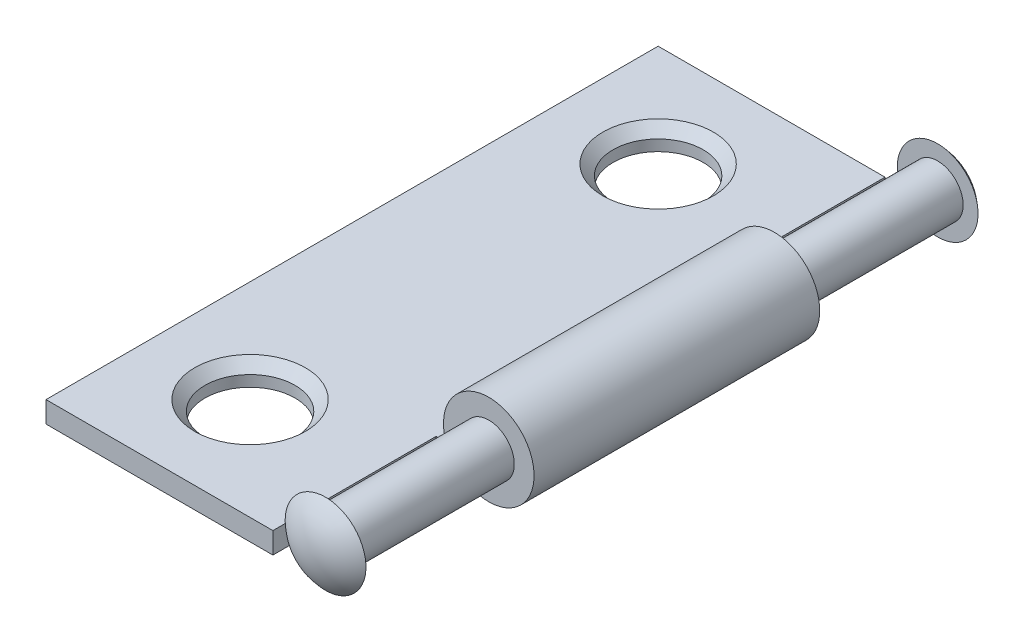
ISO-10303-21;
HEADER;
FILE_DESCRIPTION(('STEP AP214'),'2;1');
FILE_NAME('part.step','',(''),(''),'','','');
FILE_SCHEMA(('AUTOMOTIVE_DESIGN { 1 0 10303 214 1 1 1 1 }'));
ENDSEC;
DATA;
#1=APPLICATION_CONTEXT('core data for automotive mechanical design processes');
#2=APPLICATION_PROTOCOL_DEFINITION('international standard','automotive_design',2000,#1);
#3=PRODUCT_CONTEXT('',#1,'mechanical');
#4=PRODUCT('Part','Part','',(#3));
#5=PRODUCT_RELATED_PRODUCT_CATEGORY('part','',(#4));
#6=PRODUCT_DEFINITION_FORMATION('','',#4);
#7=PRODUCT_DEFINITION_CONTEXT('part definition',#1,'design');
#8=PRODUCT_DEFINITION('design','',#6,#7);
#9=PRODUCT_DEFINITION_SHAPE('','',#8);
#10=(LENGTH_UNIT() NAMED_UNIT(*) SI_UNIT(.MILLI.,.METRE.));
#11=(NAMED_UNIT(*) PLANE_ANGLE_UNIT() SI_UNIT($,.RADIAN.));
#12=(NAMED_UNIT(*) SI_UNIT($,.STERADIAN.) SOLID_ANGLE_UNIT());
#13=UNCERTAINTY_MEASURE_WITH_UNIT(LENGTH_MEASURE(1.E-05),#10,'distance_accuracy_value','');
#14=(GEOMETRIC_REPRESENTATION_CONTEXT(3) GLOBAL_UNCERTAINTY_ASSIGNED_CONTEXT((#13)) GLOBAL_UNIT_ASSIGNED_CONTEXT((#10,
#11,#12)) REPRESENTATION_CONTEXT('',''));
#15=CARTESIAN_POINT('',(0.,0.,0.));
#16=DIRECTION('',(0.,0.,1.));
#17=DIRECTION('',(1.,0.,0.));
#18=AXIS2_PLACEMENT_3D('',#15,#16,#17);
#19=CARTESIAN_POINT('',(0.,0.,-16.4461825));
#20=DIRECTION('',(0.,0.,-1.));
#21=DIRECTION('',(-1.,0.,0.));
#22=AXIS2_PLACEMENT_3D('',#19,#20,#21);
#23=SPHERICAL_SURFACE('',#22,3.6198175);
#24=CARTESIAN_POINT('',(0.,0.,-19.05));
#25=DIRECTION('',(0.,0.,-1.));
#26=DIRECTION('',(-1.,0.,0.));
#27=AXIS2_PLACEMENT_3D('',#24,#25,#26);
#28=CIRCLE('',#27,2.5146);
#29=CARTESIAN_POINT('',(-2.5146,0.,-19.05));
#30=VERTEX_POINT('',#29);
#31=EDGE_CURVE('E11',#30,#30,#28,.T.);
#32=ORIENTED_EDGE('',*,*,#31,.T.);
#33=EDGE_LOOP('',(#32));
#34=FACE_BOUND('',#33,.T.);
#35=ADVANCED_FACE('F45',(#34),#23,.T.);
#36=CARTESIAN_POINT('',(-1.5875,0.,-19.05));
#37=DIRECTION('',(0.,0.,1.));
#38=DIRECTION('',(1.,0.,0.));
#39=AXIS2_PLACEMENT_3D('',#36,#37,#38);
#40=PLANE('',#39);
#41=CARTESIAN_POINT('',(0.,0.,-19.05));
#42=DIRECTION('',(0.,0.,-1.));
#43=DIRECTION('',(-1.,0.,0.));
#44=AXIS2_PLACEMENT_3D('',#41,#42,#43);
#45=CIRCLE('',#44,1.5875);
#46=CARTESIAN_POINT('',(-1.5875,0.,-19.05));
#47=VERTEX_POINT('',#46);
#48=EDGE_CURVE('E51',#47,#47,#45,.T.);
#49=ORIENTED_EDGE('',*,*,#48,.T.);
#50=EDGE_LOOP('',(#49));
#51=FACE_BOUND('',#50,.T.);
#52=ORIENTED_EDGE('',*,*,#31,.F.);
#53=EDGE_LOOP('',(#52));
#54=FACE_BOUND('',#53,.T.);
#55=ADVANCED_FACE('F77',(#51,#54),#40,.T.);
#56=CARTESIAN_POINT('',(0.,0.,-20.066));
#57=DIRECTION('',(0.,0.,-1.));
#58=DIRECTION('',(-1.,0.,0.));
#59=AXIS2_PLACEMENT_3D('',#56,#57,#58);
#60=CYLINDRICAL_SURFACE('',#59,1.5875);
#61=CARTESIAN_POINT('',(0.,0.,19.05));
#62=DIRECTION('',(0.,0.,-1.));
#63=DIRECTION('',(-1.,0.,0.));
#64=AXIS2_PLACEMENT_3D('',#61,#62,#63);
#65=CIRCLE('',#64,1.5875);
#66=CARTESIAN_POINT('',(-1.5875,0.,19.05));
#67=VERTEX_POINT('',#66);
#68=EDGE_CURVE('E55',#67,#67,#65,.T.);
#69=ORIENTED_EDGE('',*,*,#68,.T.);
#70=EDGE_LOOP('',(#69));
#71=FACE_BOUND('',#70,.T.);
#72=ORIENTED_EDGE('',*,*,#48,.F.);
#73=EDGE_LOOP('',(#72));
#74=FACE_BOUND('',#73,.T.);
#75=ADVANCED_FACE('F74',(#71,#74),#60,.T.);
#76=CARTESIAN_POINT('',(-2.5146,0.,19.05));
#77=DIRECTION('',(0.,0.,-1.));
#78=DIRECTION('',(-1.,0.,0.));
#79=AXIS2_PLACEMENT_3D('',#76,#77,#78);
#80=PLANE('',#79);
#81=CARTESIAN_POINT('',(0.,0.,19.05));
#82=DIRECTION('',(0.,0.,-1.));
#83=DIRECTION('',(-1.,0.,0.));
#84=AXIS2_PLACEMENT_3D('',#81,#82,#83);
#85=CIRCLE('',#84,2.5146);
#86=CARTESIAN_POINT('',(-2.5146,0.,19.05));
#87=VERTEX_POINT('',#86);
#88=EDGE_CURVE('E59',#87,#87,#85,.T.);
#89=ORIENTED_EDGE('',*,*,#88,.T.);
#90=EDGE_LOOP('',(#89));
#91=FACE_BOUND('',#90,.T.);
#92=ORIENTED_EDGE('',*,*,#68,.F.);
#93=EDGE_LOOP('',(#92));
#94=FACE_BOUND('',#93,.T.);
#95=ADVANCED_FACE('F65',(#91,#94),#80,.T.);
#96=CARTESIAN_POINT('',(0.,0.,16.4461825));
#97=DIRECTION('',(0.,0.,-1.));
#98=DIRECTION('',(-1.,0.,0.));
#99=AXIS2_PLACEMENT_3D('',#96,#97,#98);
#100=SPHERICAL_SURFACE('',#99,3.61981750000001);
#101=ORIENTED_EDGE('',*,*,#88,.F.);
#102=EDGE_LOOP('',(#101));
#103=FACE_BOUND('',#102,.T.);
#104=ADVANCED_FACE('F68',(#103),#100,.T.);
#105=CLOSED_SHELL('',(#35,#55,#75,#95,#104));
#106=MANIFOLD_SOLID_BREP('B2',#105);
#107=CARTESIAN_POINT('',(0.,0.,19.05));
#108=DIRECTION('',(0.,0.,-1.));
#109=DIRECTION('',(-1.,0.,0.));
#110=AXIS2_PLACEMENT_3D('',#107,#108,#109);
#111=CYLINDRICAL_SURFACE('',#110,2.8194);
#112=CARTESIAN_POINT('',(0.,0.,-8.89));
#113=DIRECTION('',(0.,0.,-1.));
#114=DIRECTION('',(-1.,0.,0.));
#115=AXIS2_PLACEMENT_3D('',#112,#113,#114);
#116=CIRCLE('',#115,2.8194);
#117=CARTESIAN_POINT('',(-2.66261186619455,-0.927099999999998,-8.89));
#118=VERTEX_POINT('',#117);
#119=CARTESIAN_POINT('',(-1.26684619394999,-2.51875308056872,-8.88999999999999));
#120=VERTEX_POINT('',#119);
#121=EDGE_CURVE('E142',#118,#120,#116,.T.);
#122=ORIENTED_EDGE('',*,*,#121,.F.);
#123=DIRECTION('',(0.,0.,-1.));
#124=VECTOR('',#123,1.);
#125=CARTESIAN_POINT('',(-2.66261186619455,-0.927099999999998,34.8027168521072));
#126=LINE('',#125,#124);
#127=CARTESIAN_POINT('',(-2.66261186619455,-0.927099999999998,8.89));
#128=VERTEX_POINT('',#127);
#129=EDGE_CURVE('E223',#128,#118,#126,.T.);
#130=ORIENTED_EDGE('',*,*,#129,.F.);
#131=CARTESIAN_POINT('',(0.,0.,8.89));
#132=DIRECTION('',(0.,0.,-1.));
#133=DIRECTION('',(-1.,0.,0.));
#134=AXIS2_PLACEMENT_3D('',#131,#132,#133);
#135=CIRCLE('',#134,2.8194);
#136=CARTESIAN_POINT('',(-1.26684619394999,-2.51875308056872,8.89));
#137=VERTEX_POINT('',#136);
#138=EDGE_CURVE('E238',#128,#137,#135,.T.);
#139=ORIENTED_EDGE('',*,*,#138,.T.);
#140=DIRECTION('',(0.,0.,-1.));
#141=VECTOR('',#140,1.);
#142=CARTESIAN_POINT('',(-1.26684619394999,-2.51875308056872,19.05));
#143=LINE('',#142,#141);
#144=EDGE_CURVE('E259',#137,#120,#143,.T.);
#145=ORIENTED_EDGE('',*,*,#144,.T.);
#146=EDGE_LOOP('',(#122,#130,#139,#145));
#147=FACE_BOUND('',#146,.T.);
#148=ADVANCED_FACE('F126',(#147),#111,.T.);
#149=CARTESIAN_POINT('',(0.,0.,19.05));
#150=DIRECTION('',(0.,0.,-1.));
#151=DIRECTION('',(-1.,0.,0.));
#152=AXIS2_PLACEMENT_3D('',#149,#150,#151);
#153=CYLINDRICAL_SURFACE('',#152,1.5875);
#154=CARTESIAN_POINT('',(0.,0.,8.89));
#155=DIRECTION('',(0.,0.,-1.));
#156=DIRECTION('',(-1.,0.,0.));
#157=AXIS2_PLACEMENT_3D('',#154,#155,#156);
#158=CIRCLE('',#157,1.5875);
#159=CARTESIAN_POINT('',(-1.5875,0.,8.89));
#160=VERTEX_POINT('',#159);
#161=EDGE_CURVE('E243',#160,#160,#158,.T.);
#162=CARTESIAN_POINT('',(0.,0.,-8.89));
#163=DIRECTION('',(0.,0.,-1.));
#164=DIRECTION('',(-1.,0.,0.));
#165=AXIS2_PLACEMENT_3D('',#162,#163,#164);
#166=CIRCLE('',#165,1.5875);
#167=CARTESIAN_POINT('',(-1.5875,0.,-8.89));
#168=VERTEX_POINT('',#167);
#169=EDGE_CURVE('E212',#168,#168,#166,.T.);
#170=CARTESIAN_POINT('',(-1.5875,0.,8.89));
#171=CARTESIAN_POINT('',(-1.5875,0.,8.70479166666667));
#172=CARTESIAN_POINT('',(-1.5875,0.,8.51958333333333));
#173=CARTESIAN_POINT('',(-1.5875,0.,8.14916666666667));
#174=CARTESIAN_POINT('',(-1.5875,0.,7.96395833333333));
#175=CARTESIAN_POINT('',(-1.5875,0.,7.59354166666667));
#176=CARTESIAN_POINT('',(-1.5875,0.,7.40833333333333));
#177=CARTESIAN_POINT('',(-1.5875,0.,7.03791666666667));
#178=CARTESIAN_POINT('',(-1.5875,0.,6.85270833333333));
#179=CARTESIAN_POINT('',(-1.5875,0.,6.48229166666667));
#180=CARTESIAN_POINT('',(-1.5875,0.,6.29708333333333));
#181=CARTESIAN_POINT('',(-1.5875,0.,5.92666666666667));
#182=CARTESIAN_POINT('',(-1.5875,0.,5.74145833333333));
#183=CARTESIAN_POINT('',(-1.5875,0.,5.37104166666667));
#184=CARTESIAN_POINT('',(-1.5875,0.,5.18583333333333));
#185=CARTESIAN_POINT('',(-1.5875,0.,4.81541666666667));
#186=CARTESIAN_POINT('',(-1.5875,0.,4.63020833333333));
#187=CARTESIAN_POINT('',(-1.5875,0.,4.25979166666667));
#188=CARTESIAN_POINT('',(-1.5875,0.,4.07458333333334));
#189=CARTESIAN_POINT('',(-1.5875,0.,3.70416666666667));
#190=CARTESIAN_POINT('',(-1.5875,0.,3.51895833333334));
#191=CARTESIAN_POINT('',(-1.5875,0.,3.14854166666667));
#192=CARTESIAN_POINT('',(-1.5875,0.,2.96333333333334));
#193=CARTESIAN_POINT('',(-1.5875,0.,2.59291666666667));
#194=CARTESIAN_POINT('',(-1.5875,0.,2.40770833333334));
#195=CARTESIAN_POINT('',(-1.5875,0.,2.03729166666667));
#196=CARTESIAN_POINT('',(-1.5875,0.,1.85208333333334));
#197=CARTESIAN_POINT('',(-1.5875,0.,1.48166666666667));
#198=CARTESIAN_POINT('',(-1.5875,0.,1.29645833333334));
#199=CARTESIAN_POINT('',(-1.5875,0.,0.926041666666669));
#200=CARTESIAN_POINT('',(-1.5875,0.,0.740833333333336));
#201=CARTESIAN_POINT('',(-1.5875,0.,0.370416666666671));
#202=CARTESIAN_POINT('',(-1.5875,0.,0.185208333333337));
#203=CARTESIAN_POINT('',(-1.5875,0.,-0.18520833333333));
#204=CARTESIAN_POINT('',(-1.5875,0.,-0.370416666666664));
#205=CARTESIAN_POINT('',(-1.5875,0.,-0.740833333333329));
#206=CARTESIAN_POINT('',(-1.5875,0.,-0.926041666666662));
#207=CARTESIAN_POINT('',(-1.5875,0.,-1.29645833333333));
#208=CARTESIAN_POINT('',(-1.5875,0.,-1.48166666666666));
#209=CARTESIAN_POINT('',(-1.5875,0.,-1.85208333333333));
#210=CARTESIAN_POINT('',(-1.5875,0.,-2.03729166666666));
#211=CARTESIAN_POINT('',(-1.5875,0.,-2.40770833333333));
#212=CARTESIAN_POINT('',(-1.5875,0.,-2.59291666666666));
#213=CARTESIAN_POINT('',(-1.5875,0.,-2.96333333333333));
#214=CARTESIAN_POINT('',(-1.5875,0.,-3.14854166666666));
#215=CARTESIAN_POINT('',(-1.5875,0.,-3.51895833333333));
#216=CARTESIAN_POINT('',(-1.5875,0.,-3.70416666666666));
#217=CARTESIAN_POINT('',(-1.5875,0.,-4.07458333333333));
#218=CARTESIAN_POINT('',(-1.5875,0.,-4.25979166666666));
#219=CARTESIAN_POINT('',(-1.5875,0.,-4.63020833333333));
#220=CARTESIAN_POINT('',(-1.5875,0.,-4.81541666666666));
#221=CARTESIAN_POINT('',(-1.5875,0.,-5.18583333333333));
#222=CARTESIAN_POINT('',(-1.5875,0.,-5.37104166666666));
#223=CARTESIAN_POINT('',(-1.5875,0.,-5.74145833333333));
#224=CARTESIAN_POINT('',(-1.5875,0.,-5.92666666666666));
#225=CARTESIAN_POINT('',(-1.5875,0.,-6.29708333333333));
#226=CARTESIAN_POINT('',(-1.5875,0.,-6.48229166666666));
#227=CARTESIAN_POINT('',(-1.5875,0.,-6.85270833333333));
#228=CARTESIAN_POINT('',(-1.5875,0.,-7.03791666666666));
#229=CARTESIAN_POINT('',(-1.5875,0.,-7.40833333333333));
#230=CARTESIAN_POINT('',(-1.5875,0.,-7.59354166666666));
#231=CARTESIAN_POINT('',(-1.5875,0.,-7.96395833333333));
#232=CARTESIAN_POINT('',(-1.5875,0.,-8.14916666666666));
#233=CARTESIAN_POINT('',(-1.5875,0.,-8.51958333333333));
#234=CARTESIAN_POINT('',(-1.5875,0.,-8.70479166666666));
#235=CARTESIAN_POINT('',(-1.5875,0.,-8.89));
#236=B_SPLINE_CURVE_WITH_KNOTS('',3,(#170,#171,#172,#173,#174,#175,#176,#177,#178,#179,#180,
#181,#182,#183,#184,#185,#186,#187,#188,#189,#190,#191,#192,#193,#194,#195,#196,#197,#198,#199,
#200,#201,#202,#203,#204,#205,#206,#207,#208,#209,#210,#211,#212,#213,#214,#215,#216,#217,#218,
#219,#220,#221,#222,#223,#224,#225,#226,#227,#228,#229,#230,#231,#232,#233,#234,#235),
.UNSPECIFIED.,.F.,.F.,(4,2,2,2,2,2,2,2,2,2,2,2,2,2,2,2,2,2,2,2,2,2,2,2,2,2,2,2,2,2,2,2,4),(0.,
0.555625000000001,1.11125,1.666875,2.2225,2.778125,3.33375,3.889375,4.445,5.000625,5.55625,
6.111875,6.6675,7.223125,7.77875,8.334375,8.89,9.445625,10.00125,10.556875,11.1125,11.668125,
12.22375,12.779375,13.335,13.890625,14.44625,15.001875,15.5575,16.113125,16.66875,17.224375,
17.78),.UNSPECIFIED.);
#237=EDGE_CURVE('BSEAM314',#160,#168,#236,.T.);
#238=ORIENTED_EDGE('',*,*,#161,.F.);
#239=ORIENTED_EDGE('',*,*,#169,.T.);
#240=ORIENTED_EDGE('',*,*,#237,.T.);
#241=ORIENTED_EDGE('',*,*,#237,.F.);
#242=EDGE_LOOP('',(#238,#240,#239,#241));
#243=FACE_BOUND('',#242,.T.);
#244=ADVANCED_FACE('F314',(#243),#153,.F.);
#245=CARTESIAN_POINT('',(-2.40814907138242,-4.7879,19.05));
#246=DIRECTION('',(0.,0.,-1.));
#247=DIRECTION('',(-1.,0.,0.));
#248=AXIS2_PLACEMENT_3D('',#245,#246,#247);
#249=CYLINDRICAL_SURFACE('',#248,2.54);
#250=CARTESIAN_POINT('',(-2.40814907138242,-4.7879,-8.89));
#251=DIRECTION('',(0.,0.,-1.));
#252=DIRECTION('',(-1.,0.,0.));
#253=AXIS2_PLACEMENT_3D('',#250,#251,#252);
#254=CIRCLE('',#253,2.54);
#255=CARTESIAN_POINT('',(-2.40814907138242,-2.2479,-8.89));
#256=VERTEX_POINT('',#255);
#257=EDGE_CURVE('E43',#120,#256,#254,.F.);
#258=ORIENTED_EDGE('',*,*,#257,.F.);
#259=ORIENTED_EDGE('',*,*,#144,.F.);
#260=CARTESIAN_POINT('',(-2.40814907138242,-4.7879,8.89));
#261=DIRECTION('',(0.,0.,-1.));
#262=DIRECTION('',(-1.,0.,0.));
#263=AXIS2_PLACEMENT_3D('',#260,#261,#262);
#264=CIRCLE('',#263,2.54);
#265=CARTESIAN_POINT('',(-2.40814907138242,-2.2479,8.89));
#266=VERTEX_POINT('',#265);
#267=EDGE_CURVE('E273',#137,#266,#264,.F.);
#268=ORIENTED_EDGE('',*,*,#267,.T.);
#269=DIRECTION('',(0.,0.,1.));
#270=VECTOR('',#269,1.);
#271=CARTESIAN_POINT('',(-2.40814907138242,-2.2479,19.05));
#272=LINE('',#271,#270);
#273=EDGE_CURVE('E150',#256,#266,#272,.T.);
#274=ORIENTED_EDGE('',*,*,#273,.F.);
#275=EDGE_LOOP('',(#258,#259,#268,#274));
#276=FACE_BOUND('',#275,.T.);
#277=ADVANCED_FACE('F128',(#276),#249,.F.);
#278=CARTESIAN_POINT('',(0.,0.,19.05));
#279=DIRECTION('',(0.,0.,1.));
#280=DIRECTION('',(1.,0.,0.));
#281=AXIS2_PLACEMENT_3D('',#278,#279,#280);
#282=PLANE('',#281);
#283=DIRECTION('',(1.,0.,0.));
#284=VECTOR('',#283,1.);
#285=CARTESIAN_POINT('',(-1.7017526112805,-2.2479,19.05));
#286=LINE('',#285,#284);
#287=CARTESIAN_POINT('',(-17.399,-2.2479,19.05));
#288=VERTEX_POINT('',#287);
#289=CARTESIAN_POINT('',(-3.2766,-2.2479,19.05));
#290=VERTEX_POINT('',#289);
#291=EDGE_CURVE('E256',#288,#290,#286,.T.);
#292=ORIENTED_EDGE('',*,*,#291,.T.);
#293=DIRECTION('',(0.,-1.,0.));
#294=VECTOR('',#293,1.);
#295=CARTESIAN_POINT('',(-3.2766,3.2766,19.05));
#296=LINE('',#295,#294);
#297=CARTESIAN_POINT('',(-3.2766,-0.927099999999998,19.05));
#298=VERTEX_POINT('',#297);
#299=EDGE_CURVE('E232',#298,#290,#296,.T.);
#300=ORIENTED_EDGE('',*,*,#299,.F.);
#301=DIRECTION('',(-1.,0.,0.));
#302=VECTOR('',#301,1.);
#303=CARTESIAN_POINT('',(-2.66261186619455,-0.927099999999998,19.05));
#304=LINE('',#303,#302);
#305=CARTESIAN_POINT('',(-17.399,-0.9271,19.05));
#306=VERTEX_POINT('',#305);
#307=EDGE_CURVE('E263',#298,#306,#304,.T.);
#308=ORIENTED_EDGE('',*,*,#307,.T.);
#309=DIRECTION('',(0.,-1.,0.));
#310=VECTOR('',#309,1.);
#311=CARTESIAN_POINT('',(-17.399,-2.2479,19.05));
#312=LINE('',#311,#310);
#313=EDGE_CURVE('E260',#306,#288,#312,.T.);
#314=ORIENTED_EDGE('',*,*,#313,.T.);
#315=EDGE_LOOP('',(#292,#300,#308,#314));
#316=FACE_BOUND('',#315,.T.);
#317=ADVANCED_FACE('F303',(#316),#282,.T.);
#318=CARTESIAN_POINT('',(-1.7017526112805,-2.2479,34.8027168521072));
#319=DIRECTION('',(0.,1.,0.));
#320=DIRECTION('',(-1.,0.,0.));
#321=AXIS2_PLACEMENT_3D('',#318,#319,#320);
#322=PLANE('',#321);
#323=CARTESIAN_POINT('',(-11.049,-2.2479,-12.7));
#324=DIRECTION('',(0.,1.,0.));
#325=DIRECTION('',(-1.,0.,0.));
#326=AXIS2_PLACEMENT_3D('',#323,#324,#325);
#327=CIRCLE('',#326,2.8067);
#328=CARTESIAN_POINT('',(-13.8557,-2.2479,-12.7));
#329=VERTEX_POINT('',#328);
#330=EDGE_CURVE('E130',#329,#329,#327,.T.);
#331=ORIENTED_EDGE('',*,*,#330,.T.);
#332=EDGE_LOOP('',(#331));
#333=FACE_BOUND('',#332,.T.);
#334=CARTESIAN_POINT('',(-11.049,-2.2479,12.7));
#335=DIRECTION('',(0.,1.,0.));
#336=DIRECTION('',(-1.,0.,0.));
#337=AXIS2_PLACEMENT_3D('',#334,#335,#336);
#338=CIRCLE('',#337,2.8067);
#339=CARTESIAN_POINT('',(-13.8557,-2.2479,12.7));
#340=VERTEX_POINT('',#339);
#341=EDGE_CURVE('E217',#340,#340,#338,.T.);
#342=ORIENTED_EDGE('',*,*,#341,.T.);
#343=EDGE_LOOP('',(#342));
#344=FACE_BOUND('',#343,.T.);
#345=DIRECTION('',(-1.,0.,0.));
#346=VECTOR('',#345,1.);
#347=CARTESIAN_POINT('',(-1.7017526112805,-2.2479,-19.05));
#348=LINE('',#347,#346);
#349=CARTESIAN_POINT('',(-3.2766,-2.2479,-19.05));
#350=VERTEX_POINT('',#349);
#351=CARTESIAN_POINT('',(-17.399,-2.2479,-19.05));
#352=VERTEX_POINT('',#351);
#353=EDGE_CURVE('E253',#350,#352,#348,.T.);
#354=ORIENTED_EDGE('',*,*,#353,.F.);
#355=DIRECTION('',(0.,0.,1.));
#356=VECTOR('',#355,1.);
#357=CARTESIAN_POINT('',(-3.2766,-2.2479,34.8027168521072));
#358=LINE('',#357,#356);
#359=CARTESIAN_POINT('',(-3.2766,-2.2479,-8.89));
#360=VERTEX_POINT('',#359);
#361=EDGE_CURVE('E211',#350,#360,#358,.T.);
#362=ORIENTED_EDGE('',*,*,#361,.T.);
#363=DIRECTION('',(-1.,0.,0.));
#364=VECTOR('',#363,1.);
#365=CARTESIAN_POINT('',(-1.7017526112805,-2.2479,-8.89));
#366=LINE('',#365,#364);
#367=EDGE_CURVE('E216',#256,#360,#366,.T.);
#368=ORIENTED_EDGE('',*,*,#367,.F.);
#369=ORIENTED_EDGE('',*,*,#273,.T.);
#370=DIRECTION('',(-1.,0.,0.));
#371=VECTOR('',#370,1.);
#372=CARTESIAN_POINT('',(-1.7017526112805,-2.2479,8.89));
#373=LINE('',#372,#371);
#374=CARTESIAN_POINT('',(-3.2766,-2.2479,8.89));
#375=VERTEX_POINT('',#374);
#376=EDGE_CURVE('E234',#266,#375,#373,.T.);
#377=ORIENTED_EDGE('',*,*,#376,.T.);
#378=DIRECTION('',(0.,0.,-1.));
#379=VECTOR('',#378,1.);
#380=CARTESIAN_POINT('',(-3.2766,-2.2479,34.8027168521072));
#381=LINE('',#380,#379);
#382=EDGE_CURVE('E246',#290,#375,#381,.T.);
#383=ORIENTED_EDGE('',*,*,#382,.F.);
#384=ORIENTED_EDGE('',*,*,#291,.F.);
#385=DIRECTION('',(0.,0.,-1.));
#386=VECTOR('',#385,1.);
#387=CARTESIAN_POINT('',(-17.399,-2.2479,34.8027168521072));
#388=LINE('',#387,#386);
#389=EDGE_CURVE('E265',#288,#352,#388,.T.);
#390=ORIENTED_EDGE('',*,*,#389,.T.);
#391=EDGE_LOOP('',(#354,#362,#368,#369,#377,#383,#384,#390));
#392=FACE_BOUND('',#391,.T.);
#393=ADVANCED_FACE('F292',(#333,#344,#392),#322,.F.);
#394=CARTESIAN_POINT('',(-2.66261186619455,-0.927099999999998,34.8027168521072));
#395=DIRECTION('',(0.,-1.,0.));
#396=DIRECTION('',(1.,0.,0.));
#397=AXIS2_PLACEMENT_3D('',#394,#395,#396);
#398=PLANE('',#397);
#399=CARTESIAN_POINT('',(-11.049,-0.927099999999998,-12.7));
#400=DIRECTION('',(0.,1.,0.));
#401=DIRECTION('',(0.,0.,1.));
#402=AXIS2_PLACEMENT_3D('',#399,#400,#401);
#403=CIRCLE('',#402,3.4417);
#404=CARTESIAN_POINT('',(-11.049,-0.927099999999998,-9.2583));
#405=VERTEX_POINT('',#404);
#406=EDGE_CURVE('E365',#405,#405,#403,.T.);
#407=ORIENTED_EDGE('',*,*,#406,.F.);
#408=EDGE_LOOP('',(#407));
#409=FACE_BOUND('',#408,.T.);
#410=CARTESIAN_POINT('',(-11.049,-0.927099999999998,12.7));
#411=DIRECTION('',(0.,1.,0.));
#412=DIRECTION('',(0.,0.,1.));
#413=AXIS2_PLACEMENT_3D('',#410,#411,#412);
#414=CIRCLE('',#413,3.4417);
#415=CARTESIAN_POINT('',(-11.049,-0.927099999999998,16.1417));
#416=VERTEX_POINT('',#415);
#417=EDGE_CURVE('E281',#416,#416,#414,.T.);
#418=ORIENTED_EDGE('',*,*,#417,.F.);
#419=EDGE_LOOP('',(#418));
#420=FACE_BOUND('',#419,.T.);
#421=DIRECTION('',(1.,0.,0.));
#422=VECTOR('',#421,1.);
#423=CARTESIAN_POINT('',(-2.66261186619455,-0.927099999999998,-8.89));
#424=LINE('',#423,#422);
#425=CARTESIAN_POINT('',(-3.2766,-0.927099999999998,-8.89));
#426=VERTEX_POINT('',#425);
#427=EDGE_CURVE('E215',#426,#118,#424,.T.);
#428=ORIENTED_EDGE('',*,*,#427,.F.);
#429=DIRECTION('',(0.,0.,-1.));
#430=VECTOR('',#429,1.);
#431=CARTESIAN_POINT('',(-3.2766,-0.927099999999998,34.8027168521072));
#432=LINE('',#431,#430);
#433=CARTESIAN_POINT('',(-3.2766,-0.927099999999999,-19.05));
#434=VERTEX_POINT('',#433);
#435=EDGE_CURVE('E200',#426,#434,#432,.T.);
#436=ORIENTED_EDGE('',*,*,#435,.T.);
#437=DIRECTION('',(1.,0.,0.));
#438=VECTOR('',#437,1.);
#439=CARTESIAN_POINT('',(-2.66261186619455,-0.927099999999998,-19.05));
#440=LINE('',#439,#438);
#441=CARTESIAN_POINT('',(-17.399,-0.9271,-19.05));
#442=VERTEX_POINT('',#441);
#443=EDGE_CURVE('E248',#442,#434,#440,.T.);
#444=ORIENTED_EDGE('',*,*,#443,.F.);
#445=DIRECTION('',(0.,0.,-1.));
#446=VECTOR('',#445,1.);
#447=CARTESIAN_POINT('',(-17.399,-0.9271,34.8027168521072));
#448=LINE('',#447,#446);
#449=EDGE_CURVE('E255',#306,#442,#448,.T.);
#450=ORIENTED_EDGE('',*,*,#449,.F.);
#451=ORIENTED_EDGE('',*,*,#307,.F.);
#452=DIRECTION('',(0.,0.,1.));
#453=VECTOR('',#452,1.);
#454=CARTESIAN_POINT('',(-3.2766,-0.927099999999998,34.8027168521072));
#455=LINE('',#454,#453);
#456=CARTESIAN_POINT('',(-3.2766,-0.927099999999998,8.89));
#457=VERTEX_POINT('',#456);
#458=EDGE_CURVE('E135',#457,#298,#455,.T.);
#459=ORIENTED_EDGE('',*,*,#458,.F.);
#460=DIRECTION('',(1.,0.,0.));
#461=VECTOR('',#460,1.);
#462=CARTESIAN_POINT('',(-2.66261186619455,-0.927099999999998,8.89));
#463=LINE('',#462,#461);
#464=EDGE_CURVE('E241',#457,#128,#463,.T.);
#465=ORIENTED_EDGE('',*,*,#464,.T.);
#466=ORIENTED_EDGE('',*,*,#129,.T.);
#467=EDGE_LOOP('',(#428,#436,#444,#450,#451,#459,#465,#466));
#468=FACE_BOUND('',#467,.T.);
#469=ADVANCED_FACE('F220',(#409,#420,#468),#398,.F.);
#470=CARTESIAN_POINT('',(0.,0.,-19.05));
#471=DIRECTION('',(0.,0.,1.));
#472=DIRECTION('',(1.,0.,0.));
#473=AXIS2_PLACEMENT_3D('',#470,#471,#472);
#474=PLANE('',#473);
#475=ORIENTED_EDGE('',*,*,#443,.T.);
#476=DIRECTION('',(0.,-1.,0.));
#477=VECTOR('',#476,1.);
#478=CARTESIAN_POINT('',(-3.2766,3.2766,-19.05));
#479=LINE('',#478,#477);
#480=EDGE_CURVE('E206',#434,#350,#479,.T.);
#481=ORIENTED_EDGE('',*,*,#480,.T.);
#482=ORIENTED_EDGE('',*,*,#353,.T.);
#483=DIRECTION('',(0.,1.,0.));
#484=VECTOR('',#483,1.);
#485=CARTESIAN_POINT('',(-17.399,-2.2479,-19.05));
#486=LINE('',#485,#484);
#487=EDGE_CURVE('E250',#352,#442,#486,.T.);
#488=ORIENTED_EDGE('',*,*,#487,.T.);
#489=EDGE_LOOP('',(#475,#481,#482,#488));
#490=FACE_BOUND('',#489,.T.);
#491=ADVANCED_FACE('F291',(#490),#474,.F.);
#492=CARTESIAN_POINT('',(-17.399,-2.2479,34.8027168521072));
#493=DIRECTION('',(1.,0.,0.));
#494=DIRECTION('',(0.,0.,-1.));
#495=AXIS2_PLACEMENT_3D('',#492,#493,#494);
#496=PLANE('',#495);
#497=ORIENTED_EDGE('',*,*,#313,.F.);
#498=ORIENTED_EDGE('',*,*,#449,.T.);
#499=ORIENTED_EDGE('',*,*,#487,.F.);
#500=ORIENTED_EDGE('',*,*,#389,.F.);
#501=EDGE_LOOP('',(#497,#498,#499,#500));
#502=FACE_BOUND('',#501,.T.);
#503=ADVANCED_FACE('F298',(#502),#496,.F.);
#504=CARTESIAN_POINT('',(-3.2766,3.2766,19.05));
#505=DIRECTION('',(1.,0.,0.));
#506=DIRECTION('',(0.,0.,-1.));
#507=AXIS2_PLACEMENT_3D('',#504,#505,#506);
#508=PLANE('',#507);
#509=ORIENTED_EDGE('',*,*,#382,.T.);
#510=DIRECTION('',(0.,-1.,0.));
#511=VECTOR('',#510,1.);
#512=CARTESIAN_POINT('',(-3.2766,3.2766,8.89));
#513=LINE('',#512,#511);
#514=EDGE_CURVE('E231',#457,#375,#513,.T.);
#515=ORIENTED_EDGE('',*,*,#514,.F.);
#516=ORIENTED_EDGE('',*,*,#458,.T.);
#517=ORIENTED_EDGE('',*,*,#299,.T.);
#518=EDGE_LOOP('',(#509,#515,#516,#517));
#519=FACE_BOUND('',#518,.T.);
#520=ADVANCED_FACE('F306',(#519),#508,.T.);
#521=CARTESIAN_POINT('',(0.,0.,8.89));
#522=DIRECTION('',(0.,0.,-1.));
#523=DIRECTION('',(-1.,0.,0.));
#524=AXIS2_PLACEMENT_3D('',#521,#522,#523);
#525=PLANE('',#524);
#526=ORIENTED_EDGE('',*,*,#161,.T.);
#527=EDGE_LOOP('',(#526));
#528=FACE_BOUND('',#527,.T.);
#529=ORIENTED_EDGE('',*,*,#514,.T.);
#530=ORIENTED_EDGE('',*,*,#376,.F.);
#531=ORIENTED_EDGE('',*,*,#267,.F.);
#532=ORIENTED_EDGE('',*,*,#138,.F.);
#533=ORIENTED_EDGE('',*,*,#464,.F.);
#534=EDGE_LOOP('',(#529,#530,#531,#532,#533));
#535=FACE_BOUND('',#534,.T.);
#536=ADVANCED_FACE('F309',(#528,#535),#525,.F.);
#537=CARTESIAN_POINT('',(-3.2766,3.2766,-19.05));
#538=DIRECTION('',(-1.,0.,0.));
#539=DIRECTION('',(0.,0.,1.));
#540=AXIS2_PLACEMENT_3D('',#537,#538,#539);
#541=PLANE('',#540);
#542=ORIENTED_EDGE('',*,*,#480,.F.);
#543=ORIENTED_EDGE('',*,*,#435,.F.);
#544=DIRECTION('',(0.,-1.,0.));
#545=VECTOR('',#544,1.);
#546=CARTESIAN_POINT('',(-3.2766,3.2766,-8.89));
#547=LINE('',#546,#545);
#548=EDGE_CURVE('E203',#426,#360,#547,.T.);
#549=ORIENTED_EDGE('',*,*,#548,.T.);
#550=ORIENTED_EDGE('',*,*,#361,.F.);
#551=EDGE_LOOP('',(#542,#543,#549,#550));
#552=FACE_BOUND('',#551,.T.);
#553=ADVANCED_FACE('F202',(#552),#541,.F.);
#554=CARTESIAN_POINT('',(0.,0.,-8.89));
#555=DIRECTION('',(0.,0.,-1.));
#556=DIRECTION('',(-1.,0.,0.));
#557=AXIS2_PLACEMENT_3D('',#554,#555,#556);
#558=PLANE('',#557);
#559=ORIENTED_EDGE('',*,*,#169,.F.);
#560=EDGE_LOOP('',(#559));
#561=FACE_BOUND('',#560,.T.);
#562=ORIENTED_EDGE('',*,*,#367,.T.);
#563=ORIENTED_EDGE('',*,*,#548,.F.);
#564=ORIENTED_EDGE('',*,*,#427,.T.);
#565=ORIENTED_EDGE('',*,*,#121,.T.);
#566=ORIENTED_EDGE('',*,*,#257,.T.);
#567=EDGE_LOOP('',(#562,#563,#564,#565,#566));
#568=FACE_BOUND('',#567,.T.);
#569=ADVANCED_FACE('F214',(#561,#568),#558,.T.);
#570=CARTESIAN_POINT('',(-11.049,-0.927099999999999,12.7));
#571=DIRECTION('',(0.,1.,0.));
#572=DIRECTION('',(0.,0.,1.));
#573=AXIS2_PLACEMENT_3D('',#570,#571,#572);
#574=CYLINDRICAL_SURFACE('',#573,2.8067);
#575=CARTESIAN_POINT('',(-11.049,-1.5621,12.7));
#576=DIRECTION('',(0.,1.,0.));
#577=DIRECTION('',(0.,0.,1.));
#578=AXIS2_PLACEMENT_3D('',#575,#576,#577);
#579=CIRCLE('',#578,2.8067);
#580=CARTESIAN_POINT('',(-11.049,-1.5621,15.5067));
#581=VERTEX_POINT('',#580);
#582=EDGE_CURVE('E277',#581,#581,#579,.T.);
#583=ORIENTED_EDGE('',*,*,#582,.T.);
#584=EDGE_LOOP('',(#583));
#585=FACE_BOUND('',#584,.T.);
#586=ORIENTED_EDGE('',*,*,#341,.F.);
#587=EDGE_LOOP('',(#586));
#588=FACE_BOUND('',#587,.T.);
#589=ADVANCED_FACE('F342',(#585,#588),#574,.F.);
#590=CARTESIAN_POINT('',(-11.049,-0.927099999999998,12.7));
#591=DIRECTION('',(0.,1.,0.));
#592=DIRECTION('',(0.,0.,1.));
#593=AXIS2_PLACEMENT_3D('',#590,#591,#592);
#594=CONICAL_SURFACE('',#593,3.4417,0.785398163397448);
#595=ORIENTED_EDGE('',*,*,#582,.F.);
#596=EDGE_LOOP('',(#595));
#597=FACE_BOUND('',#596,.T.);
#598=ORIENTED_EDGE('',*,*,#417,.T.);
#599=EDGE_LOOP('',(#598));
#600=FACE_BOUND('',#599,.T.);
#601=ADVANCED_FACE('F346',(#597,#600),#594,.F.);
#602=CARTESIAN_POINT('',(-11.049,-0.927099999999999,-12.7));
#603=DIRECTION('',(0.,1.,0.));
#604=DIRECTION('',(0.,0.,1.));
#605=AXIS2_PLACEMENT_3D('',#602,#603,#604);
#606=CYLINDRICAL_SURFACE('',#605,2.8067);
#607=CARTESIAN_POINT('',(-11.049,-1.5621,-12.7));
#608=DIRECTION('',(0.,1.,0.));
#609=DIRECTION('',(0.,0.,1.));
#610=AXIS2_PLACEMENT_3D('',#607,#608,#609);
#611=CIRCLE('',#610,2.8067);
#612=CARTESIAN_POINT('',(-11.049,-1.5621,-9.89330000000001));
#613=VERTEX_POINT('',#612);
#614=EDGE_CURVE('E362',#613,#613,#611,.T.);
#615=ORIENTED_EDGE('',*,*,#614,.T.);
#616=EDGE_LOOP('',(#615));
#617=FACE_BOUND('',#616,.T.);
#618=ORIENTED_EDGE('',*,*,#330,.F.);
#619=EDGE_LOOP('',(#618));
#620=FACE_BOUND('',#619,.T.);
#621=ADVANCED_FACE('F349',(#617,#620),#606,.F.);
#622=CARTESIAN_POINT('',(-11.049,-0.927099999999998,-12.7));
#623=DIRECTION('',(0.,1.,0.));
#624=DIRECTION('',(0.,0.,1.));
#625=AXIS2_PLACEMENT_3D('',#622,#623,#624);
#626=CONICAL_SURFACE('',#625,3.4417,0.785398163397448);
#627=ORIENTED_EDGE('',*,*,#614,.F.);
#628=EDGE_LOOP('',(#627));
#629=FACE_BOUND('',#628,.T.);
#630=ORIENTED_EDGE('',*,*,#406,.T.);
#631=EDGE_LOOP('',(#630));
#632=FACE_BOUND('',#631,.T.);
#633=ADVANCED_FACE('F353',(#629,#632),#626,.F.);
#634=CLOSED_SHELL('',(#148,#244,#277,#317,#393,#469,#491,#503,#520,#536,#553,#569,#589,#601,
#621,#633));
#635=MANIFOLD_SOLID_BREP('B6',#634);
#636=ADVANCED_BREP_SHAPE_REPRESENTATION('',(#18,#106,#635),#14);
#637=SHAPE_DEFINITION_REPRESENTATION(#9,#636);
ENDSEC;
END-ISO-10303-21;
